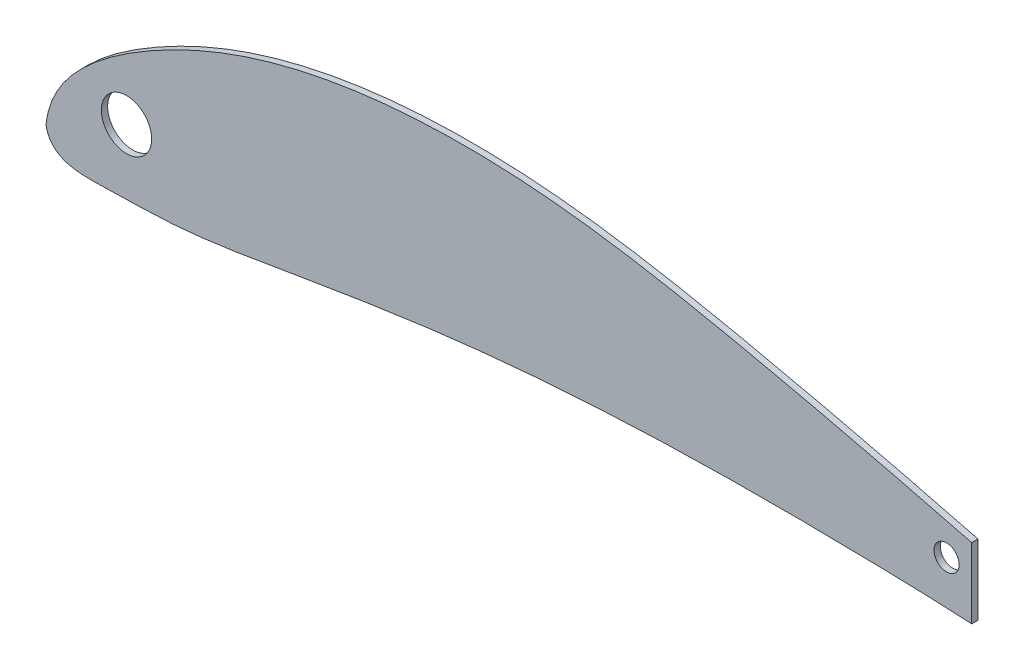
ISO-10303-21;
HEADER;
FILE_DESCRIPTION(('STEP AP214'),'2;1');
FILE_NAME('part.step','',(''),(''),'','','');
FILE_SCHEMA(('AUTOMOTIVE_DESIGN { 1 0 10303 214 1 1 1 1 }'));
ENDSEC;
DATA;
#1=APPLICATION_CONTEXT('core data for automotive mechanical design processes');
#2=APPLICATION_PROTOCOL_DEFINITION('international standard','automotive_design',2000,#1);
#3=PRODUCT_CONTEXT('',#1,'mechanical');
#4=PRODUCT('Part','Part','',(#3));
#5=PRODUCT_RELATED_PRODUCT_CATEGORY('part','',(#4));
#6=PRODUCT_DEFINITION_FORMATION('','',#4);
#7=PRODUCT_DEFINITION_CONTEXT('part definition',#1,'design');
#8=PRODUCT_DEFINITION('design','',#6,#7);
#9=PRODUCT_DEFINITION_SHAPE('','',#8);
#10=(LENGTH_UNIT() NAMED_UNIT(*) SI_UNIT(.MILLI.,.METRE.));
#11=(NAMED_UNIT(*) PLANE_ANGLE_UNIT() SI_UNIT($,.RADIAN.));
#12=(NAMED_UNIT(*) SI_UNIT($,.STERADIAN.) SOLID_ANGLE_UNIT());
#13=UNCERTAINTY_MEASURE_WITH_UNIT(LENGTH_MEASURE(1.E-05),#10,'distance_accuracy_value','');
#14=(GEOMETRIC_REPRESENTATION_CONTEXT(3) GLOBAL_UNCERTAINTY_ASSIGNED_CONTEXT((#13)) GLOBAL_UNIT_ASSIGNED_CONTEXT((#10,
#11,#12)) REPRESENTATION_CONTEXT('',''));
#15=CARTESIAN_POINT('',(0.,0.,0.));
#16=DIRECTION('',(0.,0.,1.));
#17=DIRECTION('',(1.,0.,0.));
#18=AXIS2_PLACEMENT_3D('',#15,#16,#17);
#19=CARTESIAN_POINT('',(0.000560351162113587,0.000130087070423624,1.5875));
#20=CARTESIAN_POINT('',(1.23071418869678,-6.92407609127206,1.5875));
#21=CARTESIAN_POINT('',(15.3166033306834,-6.18906584099094,1.5875));
#22=CARTESIAN_POINT('',(36.4546728163185,-6.09849990105009,1.5875));
#23=CARTESIAN_POINT('',(66.5061971849192,-0.586669106973501,1.5875));
#24=CARTESIAN_POINT('',(110.497331171581,6.18149522271792,1.5875));
#25=CARTESIAN_POINT('',(157.718638091679,9.03065014873911,1.5875));
#26=CARTESIAN_POINT('',(205.10142463584,8.83808028186313,1.5875));
#27=CARTESIAN_POINT('',(235.858814759408,7.87030619247826,1.5875));
#28=CARTESIAN_POINT('',(260.846344817159,5.42741339404395,1.5875));
#29=CARTESIAN_POINT('',(276.264022989737,4.51435670375389,1.5875));
#30=CARTESIAN_POINT('',(293.989507544058,2.09398731346533,1.5875));
#31=CARTESIAN_POINT('',(303.956832564589,1.47095520994628,1.5875));
#32=CARTESIAN_POINT('',(309.846313894505,0.000130087070423666,1.5875));
#33=B_SPLINE_CURVE_WITH_KNOTS('',3,(#19,#20,#21,#22,#23,#24,#25,#26,#27,#28,#29,#30,#31,#32),
.UNSPECIFIED.,.F.,.F.,(4,1,1,1,1,1,1,1,1,1,1,4),(0.,0.0569078595717698,0.106482711504673,
0.214488052979465,0.341297688349143,0.535095665520157,0.664680853556909,0.794660698192775,
0.828978881532905,0.904725108725214,0.942212919019968,1.),.UNSPECIFIED.);
#34=DIRECTION('',(0.,0.,-1.));
#35=VECTOR('',#34,1.);
#36=SURFACE_OF_LINEAR_EXTRUSION('',#33,#35);
#37=DIRECTION('',(0.,0.,-1.));
#38=VECTOR('',#37,1.);
#39=CARTESIAN_POINT('',(233.646313894505,7.69052977092525,1.5875));
#40=LINE('',#39,#38);
#41=CARTESIAN_POINT('',(233.646313894505,7.69052977146896,1.5875));
#42=VERTEX_POINT('',#41);
#43=CARTESIAN_POINT('',(233.646313884782,7.69052977146896,0.));
#44=VERTEX_POINT('',#43);
#45=EDGE_CURVE('E55',#42,#44,#40,.T.);
#46=ORIENTED_EDGE('',*,*,#45,.F.);
#47=CARTESIAN_POINT('',(0.000560351162116727,0.000130087070423829,1.5875));
#48=VERTEX_POINT('',#47);
#49=EDGE_CURVE('E82',#48,#42,#33,.T.);
#50=ORIENTED_EDGE('',*,*,#49,.F.);
#51=DIRECTION('',(0.,0.,-1.));
#52=VECTOR('',#51,1.);
#53=CARTESIAN_POINT('',(0.000560351162116727,0.000130087070423829,1.5875));
#54=LINE('',#53,#52);
#55=CARTESIAN_POINT('',(0.000560351162116727,0.000130087070423829,0.));
#56=VERTEX_POINT('',#55);
#57=EDGE_CURVE('E48',#48,#56,#54,.T.);
#58=ORIENTED_EDGE('',*,*,#57,.T.);
#59=CARTESIAN_POINT('',(0.000560351162113587,0.000130087070423624,0.));
#60=CARTESIAN_POINT('',(1.23071418869678,-6.92407609127206,0.));
#61=CARTESIAN_POINT('',(15.3166033306834,-6.18906584099094,0.));
#62=CARTESIAN_POINT('',(36.4546728163185,-6.09849990105009,0.));
#63=CARTESIAN_POINT('',(66.5061971849192,-0.586669106973501,0.));
#64=CARTESIAN_POINT('',(110.497331171581,6.18149522271792,0.));
#65=CARTESIAN_POINT('',(157.718638091679,9.03065014873911,0.));
#66=CARTESIAN_POINT('',(205.10142463584,8.83808028186313,0.));
#67=CARTESIAN_POINT('',(235.858814759408,7.87030619247826,0.));
#68=CARTESIAN_POINT('',(260.846344817159,5.42741339404395,0.));
#69=CARTESIAN_POINT('',(276.264022989737,4.51435670375389,0.));
#70=CARTESIAN_POINT('',(293.989507544058,2.09398731346533,0.));
#71=CARTESIAN_POINT('',(303.956832564589,1.47095520994628,0.));
#72=CARTESIAN_POINT('',(309.846313894505,0.000130087070423666,0.));
#73=B_SPLINE_CURVE_WITH_KNOTS('',3,(#59,#60,#61,#62,#63,#64,#65,#66,#67,#68,#69,#70,#71,#72),
.UNSPECIFIED.,.F.,.F.,(4,1,1,1,1,1,1,1,1,1,1,4),(0.,0.0569078595717698,0.106482711504673,
0.214488052979465,0.341297688349143,0.535095665520157,0.664680853556909,0.794660698192775,
0.828978881532905,0.904725108725214,0.942212919019968,1.),.UNSPECIFIED.);
#74=EDGE_CURVE('E84',#56,#44,#73,.T.);
#75=ORIENTED_EDGE('',*,*,#74,.T.);
#76=EDGE_LOOP('',(#46,#50,#58,#75));
#77=FACE_BOUND('',#76,.T.);
#78=ADVANCED_FACE('F40',(#77),#36,.F.);
#79=CARTESIAN_POINT('',(309.846313894505,0.000130087070423864,1.5875));
#80=CARTESIAN_POINT('',(314.816918223261,-0.51620674157964,1.5875));
#81=CARTESIAN_POINT('',(301.273197720551,4.38282813873556,1.5875));
#82=CARTESIAN_POINT('',(290.359837670022,8.71099439045776,1.5875));
#83=CARTESIAN_POINT('',(256.952064400645,19.5289209482833,1.5875));
#84=CARTESIAN_POINT('',(217.961060472083,29.6129748944238,1.5875));
#85=CARTESIAN_POINT('',(173.256699242147,40.0411042779434,1.5875));
#86=CARTESIAN_POINT('',(131.400792108858,47.8848319151037,1.5875));
#87=CARTESIAN_POINT('',(89.5976184754884,49.290763053775,1.5875));
#88=CARTESIAN_POINT('',(52.1111282710831,42.0692152748914,1.5875));
#89=CARTESIAN_POINT('',(26.2867198183782,29.9751763284633,1.5875));
#90=CARTESIAN_POINT('',(8.64909202481883,17.8566051741579,1.5875));
#91=CARTESIAN_POINT('',(0.810633126632263,7.35919605469637,1.5875));
#92=CARTESIAN_POINT('',(0.000560351162116727,0.000130087070423829,1.5875));
#93=B_SPLINE_CURVE_WITH_KNOTS('',3,(#79,#80,#81,#82,#83,#84,#85,#86,#87,#88,#89,#90,#91,#92),
.UNSPECIFIED.,.F.,.F.,(4,1,1,1,1,1,1,1,1,1,1,4),(0.,0.0239417713693992,0.070244030177139,
0.147561721425381,0.308455887006792,0.442387865106874,0.551517565626309,0.687091076796298,
0.811391258419108,0.886311735305172,0.939136382225768,1.),.UNSPECIFIED.);
#94=DIRECTION('',(0.,0.,-1.));
#95=VECTOR('',#94,1.);
#96=SURFACE_OF_LINEAR_EXTRUSION('',#93,#95);
#97=DIRECTION('',(0.,0.,-1.));
#98=VECTOR('',#97,1.);
#99=CARTESIAN_POINT('',(233.646313894505,25.4527523940641,1.5875));
#100=LINE('',#99,#98);
#101=CARTESIAN_POINT('',(233.646313894505,25.4527523915985,0.));
#102=VERTEX_POINT('',#101);
#103=CARTESIAN_POINT('',(233.646313894505,25.4527523915985,1.5875));
#104=VERTEX_POINT('',#103);
#105=EDGE_CURVE('E76',#102,#104,#100,.F.);
#106=ORIENTED_EDGE('',*,*,#105,.F.);
#107=CARTESIAN_POINT('',(309.846313894505,0.000130087070423864,0.));
#108=CARTESIAN_POINT('',(314.816918223261,-0.51620674157964,0.));
#109=CARTESIAN_POINT('',(301.273197720551,4.38282813873556,0.));
#110=CARTESIAN_POINT('',(290.359837670022,8.71099439045776,0.));
#111=CARTESIAN_POINT('',(256.952064400645,19.5289209482833,0.));
#112=CARTESIAN_POINT('',(217.961060472083,29.6129748944238,0.));
#113=CARTESIAN_POINT('',(173.256699242147,40.0411042779434,0.));
#114=CARTESIAN_POINT('',(131.400792108858,47.8848319151037,0.));
#115=CARTESIAN_POINT('',(89.5976184754884,49.290763053775,0.));
#116=CARTESIAN_POINT('',(52.1111282710831,42.0692152748914,0.));
#117=CARTESIAN_POINT('',(26.2867198183782,29.9751763284633,0.));
#118=CARTESIAN_POINT('',(8.64909202481883,17.8566051741579,0.));
#119=CARTESIAN_POINT('',(0.810633126632263,7.35919605469637,0.));
#120=CARTESIAN_POINT('',(0.000560351162116727,0.000130087070423829,0.));
#121=B_SPLINE_CURVE_WITH_KNOTS('',3,(#107,#108,#109,#110,#111,#112,#113,#114,#115,#116,#117,
#118,#119,#120),.UNSPECIFIED.,.F.,.F.,(4,1,1,1,1,1,1,1,1,1,1,4),(0.,0.0239417713693992,
0.070244030177139,0.147561721425381,0.308455887006792,0.442387865106874,0.551517565626309,
0.687091076796298,0.811391258419108,0.886311735305172,0.939136382225768,1.),.UNSPECIFIED.);
#122=EDGE_CURVE('E88',#102,#56,#121,.T.);
#123=ORIENTED_EDGE('',*,*,#122,.T.);
#124=ORIENTED_EDGE('',*,*,#57,.F.);
#125=EDGE_CURVE('E63',#104,#48,#93,.T.);
#126=ORIENTED_EDGE('',*,*,#125,.F.);
#127=EDGE_LOOP('',(#106,#123,#124,#126));
#128=FACE_BOUND('',#127,.T.);
#129=ADVANCED_FACE('F108',(#128),#96,.F.);
#130=CARTESIAN_POINT('',(153.387816973495,8.33338198857885,1.5875));
#131=DIRECTION('',(0.,0.,-1.));
#132=DIRECTION('',(-1.,0.,0.));
#133=AXIS2_PLACEMENT_3D('',#130,#131,#132);
#134=PLANE('',#133);
#135=CARTESIAN_POINT('',(227.296313894505,19.0501300870704,1.5875));
#136=DIRECTION('',(0.,0.,1.));
#137=DIRECTION('',(1.,0.,0.));
#138=AXIS2_PLACEMENT_3D('',#135,#136,#137);
#139=CIRCLE('',#138,3.175);
#140=CARTESIAN_POINT('',(230.471313894505,19.0501300870704,1.5875));
#141=VERTEX_POINT('',#140);
#142=EDGE_CURVE('E85',#141,#141,#139,.T.);
#143=ORIENTED_EDGE('',*,*,#142,.F.);
#144=EDGE_LOOP('',(#143));
#145=FACE_BOUND('',#144,.T.);
#146=CARTESIAN_POINT('',(20.32,10.16,1.5875));
#147=DIRECTION('',(0.,0.,1.));
#148=DIRECTION('',(1.,0.,0.));
#149=AXIS2_PLACEMENT_3D('',#146,#147,#148);
#150=CIRCLE('',#149,6.35);
#151=CARTESIAN_POINT('',(26.67,10.16,1.5875));
#152=VERTEX_POINT('',#151);
#153=EDGE_CURVE('E177',#152,#152,#150,.T.);
#154=ORIENTED_EDGE('',*,*,#153,.F.);
#155=EDGE_LOOP('',(#154));
#156=FACE_BOUND('',#155,.T.);
#157=DIRECTION('',(0.,1.,0.));
#158=VECTOR('',#157,1.);
#159=CARTESIAN_POINT('',(233.646313894505,-6.34986991292955,1.5875));
#160=LINE('',#159,#158);
#161=EDGE_CURVE('E73',#42,#104,#160,.T.);
#162=ORIENTED_EDGE('',*,*,#161,.T.);
#163=ORIENTED_EDGE('',*,*,#125,.T.);
#164=ORIENTED_EDGE('',*,*,#49,.T.);
#165=EDGE_LOOP('',(#162,#163,#164));
#166=FACE_BOUND('',#165,.T.);
#167=ADVANCED_FACE('F87',(#145,#156,#166),#134,.F.);
#168=CARTESIAN_POINT('',(153.387816973495,8.33338198857885,0.));
#169=DIRECTION('',(0.,0.,-1.));
#170=DIRECTION('',(-1.,0.,0.));
#171=AXIS2_PLACEMENT_3D('',#168,#169,#170);
#172=PLANE('',#171);
#173=CARTESIAN_POINT('',(20.32,10.16,0.));
#174=DIRECTION('',(0.,0.,1.));
#175=DIRECTION('',(1.,0.,0.));
#176=AXIS2_PLACEMENT_3D('',#173,#174,#175);
#177=CIRCLE('',#176,6.35);
#178=CARTESIAN_POINT('',(26.67,10.16,0.));
#179=VERTEX_POINT('',#178);
#180=EDGE_CURVE('E174',#179,#179,#177,.T.);
#181=ORIENTED_EDGE('',*,*,#180,.T.);
#182=EDGE_LOOP('',(#181));
#183=FACE_BOUND('',#182,.T.);
#184=CARTESIAN_POINT('',(227.296313894505,19.0501300870704,0.));
#185=DIRECTION('',(0.,0.,1.));
#186=DIRECTION('',(1.,0.,0.));
#187=AXIS2_PLACEMENT_3D('',#184,#185,#186);
#188=CIRCLE('',#187,3.175);
#189=CARTESIAN_POINT('',(230.471313894505,19.0501300870704,0.));
#190=VERTEX_POINT('',#189);
#191=EDGE_CURVE('E179',#190,#190,#188,.T.);
#192=ORIENTED_EDGE('',*,*,#191,.T.);
#193=EDGE_LOOP('',(#192));
#194=FACE_BOUND('',#193,.T.);
#195=ORIENTED_EDGE('',*,*,#122,.F.);
#196=DIRECTION('',(0.,-1.,0.));
#197=VECTOR('',#196,1.);
#198=CARTESIAN_POINT('',(233.646313894505,8.33338198857885,0.));
#199=LINE('',#198,#197);
#200=EDGE_CURVE('E11',#102,#44,#199,.T.);
#201=ORIENTED_EDGE('',*,*,#200,.T.);
#202=ORIENTED_EDGE('',*,*,#74,.F.);
#203=EDGE_LOOP('',(#195,#201,#202));
#204=FACE_BOUND('',#203,.T.);
#205=ADVANCED_FACE('F112',(#183,#194,#204),#172,.T.);
#206=CARTESIAN_POINT('',(227.296313894505,19.0501300870704,0.));
#207=DIRECTION('',(0.,0.,1.));
#208=DIRECTION('',(1.,0.,0.));
#209=AXIS2_PLACEMENT_3D('',#206,#207,#208);
#210=CYLINDRICAL_SURFACE('',#209,3.175);
#211=ORIENTED_EDGE('',*,*,#191,.F.);
#212=EDGE_LOOP('',(#211));
#213=FACE_BOUND('',#212,.T.);
#214=ORIENTED_EDGE('',*,*,#142,.T.);
#215=EDGE_LOOP('',(#214));
#216=FACE_BOUND('',#215,.T.);
#217=ADVANCED_FACE('F115',(#213,#216),#210,.F.);
#218=CARTESIAN_POINT('',(20.32,10.16,0.));
#219=DIRECTION('',(0.,0.,1.));
#220=DIRECTION('',(1.,0.,0.));
#221=AXIS2_PLACEMENT_3D('',#218,#219,#220);
#222=CYLINDRICAL_SURFACE('',#221,6.35);
#223=ORIENTED_EDGE('',*,*,#180,.F.);
#224=EDGE_LOOP('',(#223));
#225=FACE_BOUND('',#224,.T.);
#226=ORIENTED_EDGE('',*,*,#153,.T.);
#227=EDGE_LOOP('',(#226));
#228=FACE_BOUND('',#227,.T.);
#229=ADVANCED_FACE('F122',(#225,#228),#222,.F.);
#230=CARTESIAN_POINT('',(233.646313894505,-6.34986991292955,0.));
#231=DIRECTION('',(1.,0.,0.));
#232=DIRECTION('',(0.,0.,-1.));
#233=AXIS2_PLACEMENT_3D('',#230,#231,#232);
#234=PLANE('',#233);
#235=ORIENTED_EDGE('',*,*,#45,.T.);
#236=ORIENTED_EDGE('',*,*,#200,.F.);
#237=ORIENTED_EDGE('',*,*,#105,.T.);
#238=ORIENTED_EDGE('',*,*,#161,.F.);
#239=EDGE_LOOP('',(#235,#236,#237,#238));
#240=FACE_BOUND('',#239,.T.);
#241=ADVANCED_FACE('F74',(#240),#234,.T.);
#242=CLOSED_SHELL('',(#78,#129,#167,#205,#217,#229,#241));
#243=MANIFOLD_SOLID_BREP('B2',#242);
#244=ADVANCED_BREP_SHAPE_REPRESENTATION('',(#18,#243),#14);
#245=SHAPE_DEFINITION_REPRESENTATION(#9,#244);
ENDSEC;
END-ISO-10303-21;
